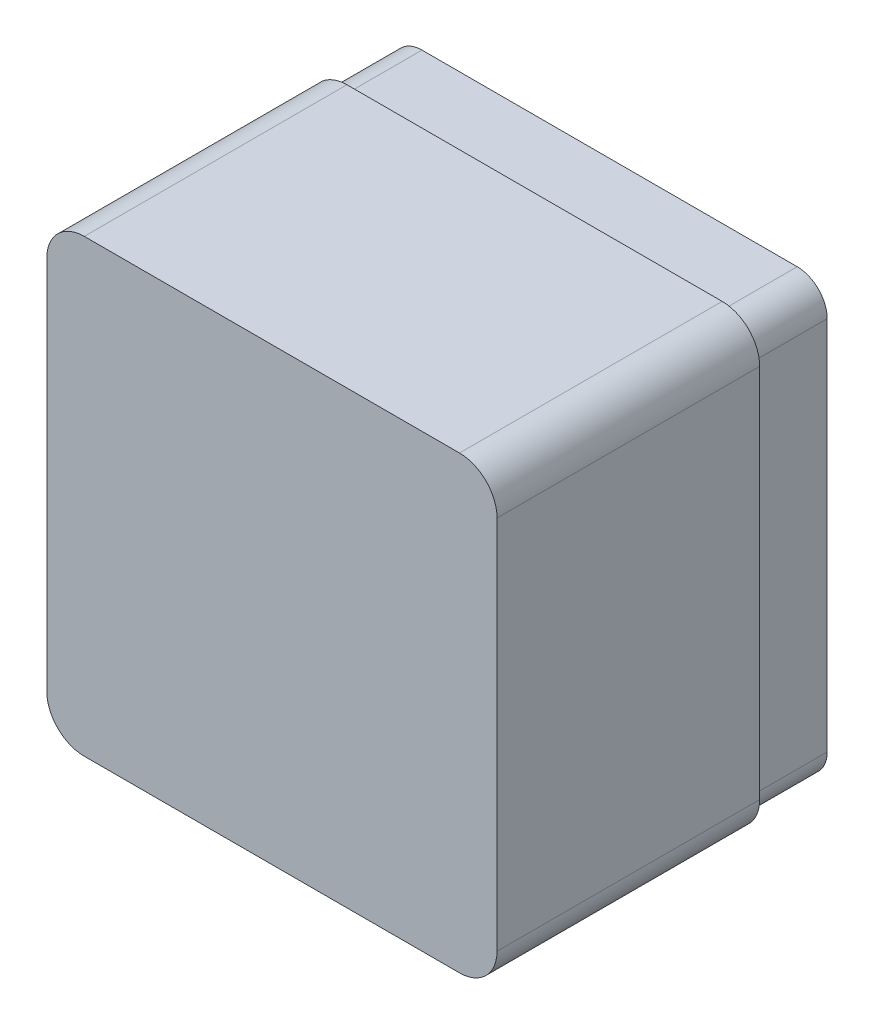
ISO-10303-21;
HEADER;
FILE_DESCRIPTION(('STEP AP214'),'2;1');
FILE_NAME('part.step','',(''),(''),'','','');
FILE_SCHEMA(('AUTOMOTIVE_DESIGN { 1 0 10303 214 1 1 1 1 }'));
ENDSEC;
DATA;
#1=APPLICATION_CONTEXT('core data for automotive mechanical design processes');
#2=APPLICATION_PROTOCOL_DEFINITION('international standard','automotive_design',2000,#1);
#3=PRODUCT_CONTEXT('',#1,'mechanical');
#4=PRODUCT('Part','Part','',(#3));
#5=PRODUCT_RELATED_PRODUCT_CATEGORY('part','',(#4));
#6=PRODUCT_DEFINITION_FORMATION('','',#4);
#7=PRODUCT_DEFINITION_CONTEXT('part definition',#1,'design');
#8=PRODUCT_DEFINITION('design','',#6,#7);
#9=PRODUCT_DEFINITION_SHAPE('','',#8);
#10=(LENGTH_UNIT() NAMED_UNIT(*) SI_UNIT(.MILLI.,.METRE.));
#11=(NAMED_UNIT(*) PLANE_ANGLE_UNIT() SI_UNIT($,.RADIAN.));
#12=(NAMED_UNIT(*) SI_UNIT($,.STERADIAN.) SOLID_ANGLE_UNIT());
#13=UNCERTAINTY_MEASURE_WITH_UNIT(LENGTH_MEASURE(1.E-05),#10,'distance_accuracy_value','');
#14=(GEOMETRIC_REPRESENTATION_CONTEXT(3) GLOBAL_UNCERTAINTY_ASSIGNED_CONTEXT((#13)) GLOBAL_UNIT_ASSIGNED_CONTEXT((#10,
#11,#12)) REPRESENTATION_CONTEXT('',''));
#15=CARTESIAN_POINT('',(0.,0.,0.));
#16=DIRECTION('',(0.,0.,1.));
#17=DIRECTION('',(1.,0.,0.));
#18=AXIS2_PLACEMENT_3D('',#15,#16,#17);
#19=CARTESIAN_POINT('',(0.,0.,0.));
#20=DIRECTION('',(0.,0.,-1.));
#21=DIRECTION('',(-1.,0.,0.));
#22=AXIS2_PLACEMENT_3D('',#19,#20,#21);
#23=PLANE('',#22);
#24=CARTESIAN_POINT('',(110.,10.,0.));
#25=DIRECTION('',(0.,0.,-1.));
#26=DIRECTION('',(-1.,0.,0.));
#27=AXIS2_PLACEMENT_3D('',#24,#25,#26);
#28=CIRCLE('',#27,6.);
#29=CARTESIAN_POINT('',(116.,10.,0.));
#30=VERTEX_POINT('',#29);
#31=CARTESIAN_POINT('',(110.,4.,0.));
#32=VERTEX_POINT('',#31);
#33=EDGE_CURVE('E365',#30,#32,#28,.T.);
#34=ORIENTED_EDGE('',*,*,#33,.F.);
#35=DIRECTION('',(0.,1.,0.));
#36=VECTOR('',#35,1.);
#37=CARTESIAN_POINT('',(116.,0.,0.));
#38=LINE('',#37,#36);
#39=CARTESIAN_POINT('',(116.,110.,0.));
#40=VERTEX_POINT('',#39);
#41=EDGE_CURVE('E387',#30,#40,#38,.T.);
#42=ORIENTED_EDGE('',*,*,#41,.T.);
#43=CARTESIAN_POINT('',(110.,110.,0.));
#44=DIRECTION('',(0.,0.,-1.));
#45=DIRECTION('',(-1.,0.,0.));
#46=AXIS2_PLACEMENT_3D('',#43,#44,#45);
#47=CIRCLE('',#46,6.);
#48=CARTESIAN_POINT('',(110.,116.,0.));
#49=VERTEX_POINT('',#48);
#50=EDGE_CURVE('E388',#49,#40,#47,.T.);
#51=ORIENTED_EDGE('',*,*,#50,.F.);
#52=DIRECTION('',(-1.,0.,0.));
#53=VECTOR('',#52,1.);
#54=CARTESIAN_POINT('',(0.,116.,0.));
#55=LINE('',#54,#53);
#56=CARTESIAN_POINT('',(9.99999999999998,116.,0.));
#57=VERTEX_POINT('',#56);
#58=EDGE_CURVE('E330',#49,#57,#55,.T.);
#59=ORIENTED_EDGE('',*,*,#58,.T.);
#60=CARTESIAN_POINT('',(9.99999999999999,110.,0.));
#61=DIRECTION('',(0.,0.,-1.));
#62=DIRECTION('',(-1.,0.,0.));
#63=AXIS2_PLACEMENT_3D('',#60,#61,#62);
#64=CIRCLE('',#63,6.);
#65=CARTESIAN_POINT('',(3.99999999999999,110.,0.));
#66=VERTEX_POINT('',#65);
#67=EDGE_CURVE('E369',#66,#57,#64,.T.);
#68=ORIENTED_EDGE('',*,*,#67,.F.);
#69=DIRECTION('',(0.,-1.,0.));
#70=VECTOR('',#69,1.);
#71=CARTESIAN_POINT('',(4.,0.,0.));
#72=LINE('',#71,#70);
#73=CARTESIAN_POINT('',(4.,10.,0.));
#74=VERTEX_POINT('',#73);
#75=EDGE_CURVE('E319',#66,#74,#72,.T.);
#76=ORIENTED_EDGE('',*,*,#75,.T.);
#77=CARTESIAN_POINT('',(9.99999999999999,10.,0.));
#78=DIRECTION('',(0.,0.,-1.));
#79=DIRECTION('',(-1.,0.,0.));
#80=AXIS2_PLACEMENT_3D('',#77,#78,#79);
#81=CIRCLE('',#80,6.);
#82=CARTESIAN_POINT('',(10.,4.,0.));
#83=VERTEX_POINT('',#82);
#84=EDGE_CURVE('E383',#83,#74,#81,.T.);
#85=ORIENTED_EDGE('',*,*,#84,.F.);
#86=DIRECTION('',(1.,0.,0.));
#87=VECTOR('',#86,1.);
#88=CARTESIAN_POINT('',(0.,4.,0.));
#89=LINE('',#88,#87);
#90=EDGE_CURVE('E380',#83,#32,#89,.T.);
#91=ORIENTED_EDGE('',*,*,#90,.T.);
#92=EDGE_LOOP('',(#34,#42,#51,#59,#68,#76,#85,#91));
#93=FACE_BOUND('',#92,.T.);
#94=DIRECTION('',(1.,0.,0.));
#95=VECTOR('',#94,1.);
#96=CARTESIAN_POINT('',(9.99999999999998,118.,0.));
#97=LINE('',#96,#95);
#98=CARTESIAN_POINT('',(9.99999999999998,118.,0.));
#99=VERTEX_POINT('',#98);
#100=CARTESIAN_POINT('',(110.,118.,0.));
#101=VERTEX_POINT('',#100);
#102=EDGE_CURVE('E228',#99,#101,#97,.T.);
#103=ORIENTED_EDGE('',*,*,#102,.T.);
#104=CARTESIAN_POINT('',(110.,110.,0.));
#105=DIRECTION('',(0.,0.,-1.));
#106=DIRECTION('',(-1.,0.,0.));
#107=AXIS2_PLACEMENT_3D('',#104,#105,#106);
#108=CIRCLE('',#107,7.99999999999999);
#109=CARTESIAN_POINT('',(118.,110.,0.));
#110=VERTEX_POINT('',#109);
#111=EDGE_CURVE('E255',#101,#110,#108,.T.);
#112=ORIENTED_EDGE('',*,*,#111,.T.);
#113=DIRECTION('',(0.,-1.,0.));
#114=VECTOR('',#113,1.);
#115=CARTESIAN_POINT('',(118.,110.,0.));
#116=LINE('',#115,#114);
#117=CARTESIAN_POINT('',(118.,9.99999999999999,0.));
#118=VERTEX_POINT('',#117);
#119=EDGE_CURVE('E205',#110,#118,#116,.T.);
#120=ORIENTED_EDGE('',*,*,#119,.T.);
#121=CARTESIAN_POINT('',(110.,10.,0.));
#122=DIRECTION('',(0.,0.,-1.));
#123=DIRECTION('',(-1.,0.,0.));
#124=AXIS2_PLACEMENT_3D('',#121,#122,#123);
#125=CIRCLE('',#124,7.99999999999999);
#126=CARTESIAN_POINT('',(110.,2.00000000000001,0.));
#127=VERTEX_POINT('',#126);
#128=EDGE_CURVE('E54',#118,#127,#125,.T.);
#129=ORIENTED_EDGE('',*,*,#128,.T.);
#130=DIRECTION('',(-1.,0.,0.));
#131=VECTOR('',#130,1.);
#132=CARTESIAN_POINT('',(110.,2.,0.));
#133=LINE('',#132,#131);
#134=CARTESIAN_POINT('',(9.99999999999999,2.,0.));
#135=VERTEX_POINT('',#134);
#136=EDGE_CURVE('E262',#127,#135,#133,.T.);
#137=ORIENTED_EDGE('',*,*,#136,.T.);
#138=CARTESIAN_POINT('',(9.99999999999999,10.,0.));
#139=DIRECTION('',(0.,0.,-1.));
#140=DIRECTION('',(-1.,0.,0.));
#141=AXIS2_PLACEMENT_3D('',#138,#139,#140);
#142=CIRCLE('',#141,8.);
#143=CARTESIAN_POINT('',(2.,10.,0.));
#144=VERTEX_POINT('',#143);
#145=EDGE_CURVE('E266',#135,#144,#142,.T.);
#146=ORIENTED_EDGE('',*,*,#145,.T.);
#147=DIRECTION('',(0.,1.,0.));
#148=VECTOR('',#147,1.);
#149=CARTESIAN_POINT('',(2.,10.,0.));
#150=LINE('',#149,#148);
#151=CARTESIAN_POINT('',(2.,110.,0.));
#152=VERTEX_POINT('',#151);
#153=EDGE_CURVE('E270',#144,#152,#150,.T.);
#154=ORIENTED_EDGE('',*,*,#153,.T.);
#155=CARTESIAN_POINT('',(9.99999999999999,110.,0.));
#156=DIRECTION('',(0.,0.,-1.));
#157=DIRECTION('',(-1.,0.,0.));
#158=AXIS2_PLACEMENT_3D('',#155,#156,#157);
#159=CIRCLE('',#158,7.99999999999999);
#160=EDGE_CURVE('E232',#152,#99,#159,.T.);
#161=ORIENTED_EDGE('',*,*,#160,.T.);
#162=EDGE_LOOP('',(#103,#112,#120,#129,#137,#146,#154,#161));
#163=FACE_BOUND('',#162,.T.);
#164=ADVANCED_FACE('F38',(#93,#163),#23,.T.);
#165=CARTESIAN_POINT('',(4.,0.,90.));
#166=DIRECTION('',(1.,0.,0.));
#167=DIRECTION('',(0.,1.,0.));
#168=AXIS2_PLACEMENT_3D('',#165,#166,#167);
#169=PLANE('',#168);
#170=ORIENTED_EDGE('',*,*,#75,.F.);
#171=DIRECTION('',(0.,0.,1.));
#172=VECTOR('',#171,1.);
#173=CARTESIAN_POINT('',(3.99999999999999,110.,90.));
#174=LINE('',#173,#172);
#175=CARTESIAN_POINT('',(3.99999999999999,110.,86.));
#176=VERTEX_POINT('',#175);
#177=EDGE_CURVE('E324',#176,#66,#174,.F.);
#178=ORIENTED_EDGE('',*,*,#177,.F.);
#179=DIRECTION('',(0.,-1.,0.));
#180=VECTOR('',#179,1.);
#181=CARTESIAN_POINT('',(4.,0.,86.));
#182=LINE('',#181,#180);
#183=CARTESIAN_POINT('',(4.,10.,86.));
#184=VERTEX_POINT('',#183);
#185=EDGE_CURVE('E325',#176,#184,#182,.T.);
#186=ORIENTED_EDGE('',*,*,#185,.T.);
#187=DIRECTION('',(0.,0.,1.));
#188=VECTOR('',#187,1.);
#189=CARTESIAN_POINT('',(4.,10.,90.));
#190=LINE('',#189,#188);
#191=EDGE_CURVE('E320',#74,#184,#190,.T.);
#192=ORIENTED_EDGE('',*,*,#191,.F.);
#193=EDGE_LOOP('',(#170,#178,#186,#192));
#194=FACE_BOUND('',#193,.T.);
#195=ADVANCED_FACE('F500',(#194),#169,.T.);
#196=CARTESIAN_POINT('',(0.,4.,90.));
#197=DIRECTION('',(0.,1.,0.));
#198=DIRECTION('',(0.,0.,1.));
#199=AXIS2_PLACEMENT_3D('',#196,#197,#198);
#200=PLANE('',#199);
#201=ORIENTED_EDGE('',*,*,#90,.F.);
#202=DIRECTION('',(0.,0.,1.));
#203=VECTOR('',#202,1.);
#204=CARTESIAN_POINT('',(9.99999999999999,4.,90.));
#205=LINE('',#204,#203);
#206=CARTESIAN_POINT('',(9.99999999999999,4.,86.));
#207=VERTEX_POINT('',#206);
#208=EDGE_CURVE('E362',#207,#83,#205,.F.);
#209=ORIENTED_EDGE('',*,*,#208,.F.);
#210=DIRECTION('',(1.,0.,0.));
#211=VECTOR('',#210,1.);
#212=CARTESIAN_POINT('',(0.,4.,86.));
#213=LINE('',#212,#211);
#214=CARTESIAN_POINT('',(110.,4.,86.));
#215=VERTEX_POINT('',#214);
#216=EDGE_CURVE('E329',#207,#215,#213,.T.);
#217=ORIENTED_EDGE('',*,*,#216,.T.);
#218=DIRECTION('',(0.,0.,1.));
#219=VECTOR('',#218,1.);
#220=CARTESIAN_POINT('',(110.,4.,90.));
#221=LINE('',#220,#219);
#222=EDGE_CURVE('E357',#32,#215,#221,.T.);
#223=ORIENTED_EDGE('',*,*,#222,.F.);
#224=EDGE_LOOP('',(#201,#209,#217,#223));
#225=FACE_BOUND('',#224,.T.);
#226=ADVANCED_FACE('F505',(#225),#200,.T.);
#227=CARTESIAN_POINT('',(116.,0.,90.));
#228=DIRECTION('',(-1.,0.,0.));
#229=DIRECTION('',(0.,-1.,0.));
#230=AXIS2_PLACEMENT_3D('',#227,#228,#229);
#231=PLANE('',#230);
#232=DIRECTION('',(0.,1.,0.));
#233=VECTOR('',#232,1.);
#234=CARTESIAN_POINT('',(116.,0.,86.));
#235=LINE('',#234,#233);
#236=CARTESIAN_POINT('',(116.,10.,86.));
#237=VERTEX_POINT('',#236);
#238=CARTESIAN_POINT('',(116.,110.,86.));
#239=VERTEX_POINT('',#238);
#240=EDGE_CURVE('E337',#237,#239,#235,.T.);
#241=ORIENTED_EDGE('',*,*,#240,.T.);
#242=DIRECTION('',(0.,0.,1.));
#243=VECTOR('',#242,1.);
#244=CARTESIAN_POINT('',(116.,110.,90.));
#245=LINE('',#244,#243);
#246=EDGE_CURVE('E353',#40,#239,#245,.T.);
#247=ORIENTED_EDGE('',*,*,#246,.F.);
#248=ORIENTED_EDGE('',*,*,#41,.F.);
#249=DIRECTION('',(0.,0.,1.));
#250=VECTOR('',#249,1.);
#251=CARTESIAN_POINT('',(116.,10.,90.));
#252=LINE('',#251,#250);
#253=EDGE_CURVE('E366',#237,#30,#252,.F.);
#254=ORIENTED_EDGE('',*,*,#253,.F.);
#255=EDGE_LOOP('',(#241,#247,#248,#254));
#256=FACE_BOUND('',#255,.T.);
#257=ADVANCED_FACE('F698',(#256),#231,.T.);
#258=CARTESIAN_POINT('',(0.,116.,90.));
#259=DIRECTION('',(0.,-1.,0.));
#260=DIRECTION('',(0.,0.,-1.));
#261=AXIS2_PLACEMENT_3D('',#258,#259,#260);
#262=PLANE('',#261);
#263=DIRECTION('',(-1.,0.,0.));
#264=VECTOR('',#263,1.);
#265=CARTESIAN_POINT('',(0.,116.,86.));
#266=LINE('',#265,#264);
#267=CARTESIAN_POINT('',(110.,116.,86.));
#268=VERTEX_POINT('',#267);
#269=CARTESIAN_POINT('',(9.99999999999998,116.,86.));
#270=VERTEX_POINT('',#269);
#271=EDGE_CURVE('E346',#268,#270,#266,.T.);
#272=ORIENTED_EDGE('',*,*,#271,.T.);
#273=DIRECTION('',(0.,0.,-1.));
#274=VECTOR('',#273,1.);
#275=CARTESIAN_POINT('',(9.99999999999998,116.,90.));
#276=LINE('',#275,#274);
#277=EDGE_CURVE('E341',#57,#270,#276,.F.);
#278=ORIENTED_EDGE('',*,*,#277,.F.);
#279=ORIENTED_EDGE('',*,*,#58,.F.);
#280=DIRECTION('',(0.,0.,-1.));
#281=VECTOR('',#280,1.);
#282=CARTESIAN_POINT('',(110.,116.,90.));
#283=LINE('',#282,#281);
#284=EDGE_CURVE('E333',#268,#49,#283,.T.);
#285=ORIENTED_EDGE('',*,*,#284,.F.);
#286=EDGE_LOOP('',(#272,#278,#279,#285));
#287=FACE_BOUND('',#286,.T.);
#288=ADVANCED_FACE('F689',(#287),#262,.T.);
#289=CARTESIAN_POINT('',(0.,0.,86.));
#290=DIRECTION('',(0.,0.,-1.));
#291=DIRECTION('',(-1.,0.,0.));
#292=AXIS2_PLACEMENT_3D('',#289,#290,#291);
#293=PLANE('',#292);
#294=ORIENTED_EDGE('',*,*,#216,.F.);
#295=CARTESIAN_POINT('',(9.99999999999999,10.,86.));
#296=DIRECTION('',(0.,0.,-1.));
#297=DIRECTION('',(-1.,0.,0.));
#298=AXIS2_PLACEMENT_3D('',#295,#296,#297);
#299=CIRCLE('',#298,6.);
#300=EDGE_CURVE('E349',#184,#207,#299,.F.);
#301=ORIENTED_EDGE('',*,*,#300,.F.);
#302=ORIENTED_EDGE('',*,*,#185,.F.);
#303=CARTESIAN_POINT('',(9.99999999999999,110.,86.));
#304=DIRECTION('',(0.,0.,-1.));
#305=DIRECTION('',(-1.,0.,0.));
#306=AXIS2_PLACEMENT_3D('',#303,#304,#305);
#307=CIRCLE('',#306,6.);
#308=EDGE_CURVE('E354',#270,#176,#307,.F.);
#309=ORIENTED_EDGE('',*,*,#308,.F.);
#310=ORIENTED_EDGE('',*,*,#271,.F.);
#311=CARTESIAN_POINT('',(110.,110.,86.));
#312=DIRECTION('',(0.,0.,-1.));
#313=DIRECTION('',(-1.,0.,0.));
#314=AXIS2_PLACEMENT_3D('',#311,#312,#313);
#315=CIRCLE('',#314,6.);
#316=EDGE_CURVE('E342',#239,#268,#315,.F.);
#317=ORIENTED_EDGE('',*,*,#316,.F.);
#318=ORIENTED_EDGE('',*,*,#240,.F.);
#319=CARTESIAN_POINT('',(110.,10.,86.));
#320=DIRECTION('',(0.,0.,-1.));
#321=DIRECTION('',(-1.,0.,0.));
#322=AXIS2_PLACEMENT_3D('',#319,#320,#321);
#323=CIRCLE('',#322,6.);
#324=EDGE_CURVE('E338',#215,#237,#323,.F.);
#325=ORIENTED_EDGE('',*,*,#324,.F.);
#326=EDGE_LOOP('',(#294,#301,#302,#309,#310,#317,#318,#325));
#327=FACE_BOUND('',#326,.T.);
#328=ADVANCED_FACE('F680',(#327),#293,.T.);
#329=CARTESIAN_POINT('',(110.,10.,90.));
#330=DIRECTION('',(0.,0.,-1.));
#331=DIRECTION('',(-1.,0.,0.));
#332=AXIS2_PLACEMENT_3D('',#329,#330,#331);
#333=CYLINDRICAL_SURFACE('',#332,6.);
#334=ORIENTED_EDGE('',*,*,#324,.T.);
#335=ORIENTED_EDGE('',*,*,#253,.T.);
#336=ORIENTED_EDGE('',*,*,#33,.T.);
#337=ORIENTED_EDGE('',*,*,#222,.T.);
#338=EDGE_LOOP('',(#334,#335,#336,#337));
#339=FACE_BOUND('',#338,.T.);
#340=ADVANCED_FACE('F671',(#339),#333,.F.);
#341=CARTESIAN_POINT('',(110.,110.,90.));
#342=DIRECTION('',(0.,0.,-1.));
#343=DIRECTION('',(-1.,0.,0.));
#344=AXIS2_PLACEMENT_3D('',#341,#342,#343);
#345=CYLINDRICAL_SURFACE('',#344,6.);
#346=ORIENTED_EDGE('',*,*,#316,.T.);
#347=ORIENTED_EDGE('',*,*,#284,.T.);
#348=ORIENTED_EDGE('',*,*,#50,.T.);
#349=ORIENTED_EDGE('',*,*,#246,.T.);
#350=EDGE_LOOP('',(#346,#347,#348,#349));
#351=FACE_BOUND('',#350,.T.);
#352=ADVANCED_FACE('F662',(#351),#345,.F.);
#353=CARTESIAN_POINT('',(9.99999999999999,10.,90.));
#354=DIRECTION('',(0.,0.,-1.));
#355=DIRECTION('',(-1.,0.,0.));
#356=AXIS2_PLACEMENT_3D('',#353,#354,#355);
#357=CYLINDRICAL_SURFACE('',#356,6.);
#358=ORIENTED_EDGE('',*,*,#300,.T.);
#359=ORIENTED_EDGE('',*,*,#208,.T.);
#360=ORIENTED_EDGE('',*,*,#84,.T.);
#361=ORIENTED_EDGE('',*,*,#191,.T.);
#362=EDGE_LOOP('',(#358,#359,#360,#361));
#363=FACE_BOUND('',#362,.T.);
#364=ADVANCED_FACE('F654',(#363),#357,.F.);
#365=CARTESIAN_POINT('',(9.99999999999999,110.,90.));
#366=DIRECTION('',(0.,0.,-1.));
#367=DIRECTION('',(-1.,0.,0.));
#368=AXIS2_PLACEMENT_3D('',#365,#366,#367);
#369=CYLINDRICAL_SURFACE('',#368,6.);
#370=ORIENTED_EDGE('',*,*,#308,.T.);
#371=ORIENTED_EDGE('',*,*,#177,.T.);
#372=ORIENTED_EDGE('',*,*,#67,.T.);
#373=ORIENTED_EDGE('',*,*,#277,.T.);
#374=EDGE_LOOP('',(#370,#371,#372,#373));
#375=FACE_BOUND('',#374,.T.);
#376=ADVANCED_FACE('F560',(#375),#369,.F.);
#377=CARTESIAN_POINT('',(110.,110.,20.));
#378=DIRECTION('',(0.,0.,-1.));
#379=DIRECTION('',(-1.,0.,0.));
#380=AXIS2_PLACEMENT_3D('',#377,#378,#379);
#381=PLANE('',#380);
#382=DIRECTION('',(1.,0.,0.));
#383=VECTOR('',#382,1.);
#384=CARTESIAN_POINT('',(9.99999999999998,118.,20.));
#385=LINE('',#384,#383);
#386=CARTESIAN_POINT('',(9.99999999999998,118.,20.));
#387=VERTEX_POINT('',#386);
#388=CARTESIAN_POINT('',(110.,118.,20.));
#389=VERTEX_POINT('',#388);
#390=EDGE_CURVE('E212',#387,#389,#385,.T.);
#391=ORIENTED_EDGE('',*,*,#390,.F.);
#392=CARTESIAN_POINT('',(9.99999999999999,110.,20.));
#393=DIRECTION('',(0.,0.,-1.));
#394=DIRECTION('',(-1.,0.,0.));
#395=AXIS2_PLACEMENT_3D('',#392,#393,#394);
#396=CIRCLE('',#395,7.99999999999999);
#397=CARTESIAN_POINT('',(2.,110.,20.));
#398=VERTEX_POINT('',#397);
#399=EDGE_CURVE('E249',#398,#387,#396,.T.);
#400=ORIENTED_EDGE('',*,*,#399,.F.);
#401=DIRECTION('',(0.,1.,0.));
#402=VECTOR('',#401,1.);
#403=CARTESIAN_POINT('',(2.,10.,20.));
#404=LINE('',#403,#402);
#405=CARTESIAN_POINT('',(2.,10.,20.));
#406=VERTEX_POINT('',#405);
#407=EDGE_CURVE('E245',#406,#398,#404,.T.);
#408=ORIENTED_EDGE('',*,*,#407,.F.);
#409=CARTESIAN_POINT('',(9.99999999999999,10.,20.));
#410=DIRECTION('',(0.,0.,-1.));
#411=DIRECTION('',(-1.,0.,0.));
#412=AXIS2_PLACEMENT_3D('',#409,#410,#411);
#413=CIRCLE('',#412,8.);
#414=CARTESIAN_POINT('',(9.99999999999999,2.,20.));
#415=VERTEX_POINT('',#414);
#416=EDGE_CURVE('E241',#415,#406,#413,.T.);
#417=ORIENTED_EDGE('',*,*,#416,.F.);
#418=DIRECTION('',(-1.,0.,0.));
#419=VECTOR('',#418,1.);
#420=CARTESIAN_POINT('',(110.,2.,20.));
#421=LINE('',#420,#419);
#422=CARTESIAN_POINT('',(110.,2.00000000000001,20.));
#423=VERTEX_POINT('',#422);
#424=EDGE_CURVE('E237',#423,#415,#421,.T.);
#425=ORIENTED_EDGE('',*,*,#424,.F.);
#426=CARTESIAN_POINT('',(110.,10.,20.));
#427=DIRECTION('',(0.,0.,-1.));
#428=DIRECTION('',(-1.,0.,0.));
#429=AXIS2_PLACEMENT_3D('',#426,#427,#428);
#430=CIRCLE('',#429,7.99999999999999);
#431=CARTESIAN_POINT('',(118.,9.99999999999999,20.));
#432=VERTEX_POINT('',#431);
#433=EDGE_CURVE('E222',#432,#423,#430,.T.);
#434=ORIENTED_EDGE('',*,*,#433,.F.);
#435=DIRECTION('',(0.,-1.,0.));
#436=VECTOR('',#435,1.);
#437=CARTESIAN_POINT('',(118.,110.,20.));
#438=LINE('',#437,#436);
#439=CARTESIAN_POINT('',(118.,110.,20.));
#440=VERTEX_POINT('',#439);
#441=EDGE_CURVE('E203',#440,#432,#438,.T.);
#442=ORIENTED_EDGE('',*,*,#441,.F.);
#443=CARTESIAN_POINT('',(110.,110.,20.));
#444=DIRECTION('',(0.,0.,-1.));
#445=DIRECTION('',(-1.,0.,0.));
#446=AXIS2_PLACEMENT_3D('',#443,#444,#445);
#447=CIRCLE('',#446,7.99999999999999);
#448=EDGE_CURVE('E218',#389,#440,#447,.T.);
#449=ORIENTED_EDGE('',*,*,#448,.F.);
#450=EDGE_LOOP('',(#391,#400,#408,#417,#425,#434,#442,#449));
#451=FACE_BOUND('',#450,.T.);
#452=CARTESIAN_POINT('',(110.,110.,20.));
#453=DIRECTION('',(0.,0.,-1.));
#454=DIRECTION('',(-1.,0.,0.));
#455=AXIS2_PLACEMENT_3D('',#452,#453,#454);
#456=CIRCLE('',#455,9.99999999999999);
#457=CARTESIAN_POINT('',(110.,120.,20.));
#458=VERTEX_POINT('',#457);
#459=CARTESIAN_POINT('',(120.,110.,20.));
#460=VERTEX_POINT('',#459);
#461=EDGE_CURVE('E279',#458,#460,#456,.T.);
#462=ORIENTED_EDGE('',*,*,#461,.T.);
#463=DIRECTION('',(0.,-1.,0.));
#464=VECTOR('',#463,1.);
#465=CARTESIAN_POINT('',(120.,110.,20.));
#466=LINE('',#465,#464);
#467=CARTESIAN_POINT('',(120.,10.,20.));
#468=VERTEX_POINT('',#467);
#469=EDGE_CURVE('E299',#460,#468,#466,.T.);
#470=ORIENTED_EDGE('',*,*,#469,.T.);
#471=CARTESIAN_POINT('',(110.,10.,20.));
#472=DIRECTION('',(0.,0.,-1.));
#473=DIRECTION('',(-1.,0.,0.));
#474=AXIS2_PLACEMENT_3D('',#471,#472,#473);
#475=CIRCLE('',#474,9.99999999999999);
#476=CARTESIAN_POINT('',(110.,0.,20.));
#477=VERTEX_POINT('',#476);
#478=EDGE_CURVE('E302',#468,#477,#475,.T.);
#479=ORIENTED_EDGE('',*,*,#478,.T.);
#480=DIRECTION('',(-1.,0.,0.));
#481=VECTOR('',#480,1.);
#482=CARTESIAN_POINT('',(110.,0.,20.));
#483=LINE('',#482,#481);
#484=CARTESIAN_POINT('',(9.99999999999999,0.,20.));
#485=VERTEX_POINT('',#484);
#486=EDGE_CURVE('E305',#477,#485,#483,.T.);
#487=ORIENTED_EDGE('',*,*,#486,.T.);
#488=CARTESIAN_POINT('',(9.99999999999999,10.,20.));
#489=DIRECTION('',(0.,0.,-1.));
#490=DIRECTION('',(-1.,0.,0.));
#491=AXIS2_PLACEMENT_3D('',#488,#489,#490);
#492=CIRCLE('',#491,10.);
#493=CARTESIAN_POINT('',(0.,10.,20.));
#494=VERTEX_POINT('',#493);
#495=EDGE_CURVE('E308',#485,#494,#492,.T.);
#496=ORIENTED_EDGE('',*,*,#495,.T.);
#497=DIRECTION('',(0.,1.,0.));
#498=VECTOR('',#497,1.);
#499=CARTESIAN_POINT('',(0.,10.,20.));
#500=LINE('',#499,#498);
#501=CARTESIAN_POINT('',(0.,110.,20.));
#502=VERTEX_POINT('',#501);
#503=EDGE_CURVE('E62',#494,#502,#500,.T.);
#504=ORIENTED_EDGE('',*,*,#503,.T.);
#505=CARTESIAN_POINT('',(9.99999999999999,110.,20.));
#506=DIRECTION('',(0.,0.,-1.));
#507=DIRECTION('',(-1.,0.,0.));
#508=AXIS2_PLACEMENT_3D('',#505,#506,#507);
#509=CIRCLE('',#508,10.);
#510=CARTESIAN_POINT('',(9.99999999999998,120.,20.));
#511=VERTEX_POINT('',#510);
#512=EDGE_CURVE('E313',#502,#511,#509,.T.);
#513=ORIENTED_EDGE('',*,*,#512,.T.);
#514=DIRECTION('',(1.,0.,0.));
#515=VECTOR('',#514,1.);
#516=CARTESIAN_POINT('',(9.99999999999998,120.,20.));
#517=LINE('',#516,#515);
#518=EDGE_CURVE('E316',#511,#458,#517,.T.);
#519=ORIENTED_EDGE('',*,*,#518,.T.);
#520=EDGE_LOOP('',(#462,#470,#479,#487,#496,#504,#513,#519));
#521=FACE_BOUND('',#520,.T.);
#522=ADVANCED_FACE('F217',(#451,#521),#381,.T.);
#523=CARTESIAN_POINT('',(110.,110.,20.));
#524=DIRECTION('',(0.,0.,-1.));
#525=DIRECTION('',(-1.,0.,0.));
#526=AXIS2_PLACEMENT_3D('',#523,#524,#525);
#527=CYLINDRICAL_SURFACE('',#526,7.99999999999999);
#528=ORIENTED_EDGE('',*,*,#111,.F.);
#529=DIRECTION('',(0.,0.,-1.));
#530=VECTOR('',#529,1.);
#531=CARTESIAN_POINT('',(110.,118.,20.));
#532=LINE('',#531,#530);
#533=EDGE_CURVE('E226',#389,#101,#532,.T.);
#534=ORIENTED_EDGE('',*,*,#533,.F.);
#535=ORIENTED_EDGE('',*,*,#448,.T.);
#536=DIRECTION('',(0.,0.,-1.));
#537=VECTOR('',#536,1.);
#538=CARTESIAN_POINT('',(118.,110.,20.));
#539=LINE('',#538,#537);
#540=EDGE_CURVE('E200',#440,#110,#539,.T.);
#541=ORIENTED_EDGE('',*,*,#540,.T.);
#542=EDGE_LOOP('',(#528,#534,#535,#541));
#543=FACE_BOUND('',#542,.T.);
#544=ADVANCED_FACE('F225',(#543),#527,.T.);
#545=CARTESIAN_POINT('',(9.99999999999998,118.,20.));
#546=DIRECTION('',(0.,1.,0.));
#547=DIRECTION('',(0.,0.,1.));
#548=AXIS2_PLACEMENT_3D('',#545,#546,#547);
#549=PLANE('',#548);
#550=ORIENTED_EDGE('',*,*,#102,.F.);
#551=DIRECTION('',(0.,0.,-1.));
#552=VECTOR('',#551,1.);
#553=CARTESIAN_POINT('',(9.99999999999998,118.,20.));
#554=LINE('',#553,#552);
#555=EDGE_CURVE('E280',#387,#99,#554,.T.);
#556=ORIENTED_EDGE('',*,*,#555,.F.);
#557=ORIENTED_EDGE('',*,*,#390,.T.);
#558=ORIENTED_EDGE('',*,*,#533,.T.);
#559=EDGE_LOOP('',(#550,#556,#557,#558));
#560=FACE_BOUND('',#559,.T.);
#561=ADVANCED_FACE('F568',(#560),#549,.T.);
#562=CARTESIAN_POINT('',(9.99999999999999,110.,20.));
#563=DIRECTION('',(0.,0.,-1.));
#564=DIRECTION('',(-1.,0.,0.));
#565=AXIS2_PLACEMENT_3D('',#562,#563,#564);
#566=CYLINDRICAL_SURFACE('',#565,7.99999999999999);
#567=ORIENTED_EDGE('',*,*,#160,.F.);
#568=DIRECTION('',(0.,0.,-1.));
#569=VECTOR('',#568,1.);
#570=CARTESIAN_POINT('',(2.,110.,20.));
#571=LINE('',#570,#569);
#572=EDGE_CURVE('E283',#398,#152,#571,.T.);
#573=ORIENTED_EDGE('',*,*,#572,.F.);
#574=ORIENTED_EDGE('',*,*,#399,.T.);
#575=ORIENTED_EDGE('',*,*,#555,.T.);
#576=EDGE_LOOP('',(#567,#573,#574,#575));
#577=FACE_BOUND('',#576,.T.);
#578=ADVANCED_FACE('F576',(#577),#566,.T.);
#579=CARTESIAN_POINT('',(2.,10.,20.));
#580=DIRECTION('',(-1.,0.,0.));
#581=DIRECTION('',(0.,-1.,0.));
#582=AXIS2_PLACEMENT_3D('',#579,#580,#581);
#583=PLANE('',#582);
#584=ORIENTED_EDGE('',*,*,#153,.F.);
#585=DIRECTION('',(0.,0.,-1.));
#586=VECTOR('',#585,1.);
#587=CARTESIAN_POINT('',(2.,10.,20.));
#588=LINE('',#587,#586);
#589=EDGE_CURVE('E286',#406,#144,#588,.T.);
#590=ORIENTED_EDGE('',*,*,#589,.F.);
#591=ORIENTED_EDGE('',*,*,#407,.T.);
#592=ORIENTED_EDGE('',*,*,#572,.T.);
#593=EDGE_LOOP('',(#584,#590,#591,#592));
#594=FACE_BOUND('',#593,.T.);
#595=ADVANCED_FACE('F585',(#594),#583,.T.);
#596=CARTESIAN_POINT('',(9.99999999999999,10.,20.));
#597=DIRECTION('',(0.,0.,-1.));
#598=DIRECTION('',(-1.,0.,0.));
#599=AXIS2_PLACEMENT_3D('',#596,#597,#598);
#600=CYLINDRICAL_SURFACE('',#599,8.);
#601=ORIENTED_EDGE('',*,*,#145,.F.);
#602=DIRECTION('',(0.,0.,-1.));
#603=VECTOR('',#602,1.);
#604=CARTESIAN_POINT('',(9.99999999999999,2.,20.));
#605=LINE('',#604,#603);
#606=EDGE_CURVE('E289',#415,#135,#605,.T.);
#607=ORIENTED_EDGE('',*,*,#606,.F.);
#608=ORIENTED_EDGE('',*,*,#416,.T.);
#609=ORIENTED_EDGE('',*,*,#589,.T.);
#610=EDGE_LOOP('',(#601,#607,#608,#609));
#611=FACE_BOUND('',#610,.T.);
#612=ADVANCED_FACE('F594',(#611),#600,.T.);
#613=CARTESIAN_POINT('',(110.,2.,20.));
#614=DIRECTION('',(0.,-1.,0.));
#615=DIRECTION('',(1.,0.,0.));
#616=AXIS2_PLACEMENT_3D('',#613,#614,#615);
#617=PLANE('',#616);
#618=ORIENTED_EDGE('',*,*,#136,.F.);
#619=DIRECTION('',(0.,0.,-1.));
#620=VECTOR('',#619,1.);
#621=CARTESIAN_POINT('',(110.,2.00000000000001,20.));
#622=LINE('',#621,#620);
#623=EDGE_CURVE('E292',#423,#127,#622,.T.);
#624=ORIENTED_EDGE('',*,*,#623,.F.);
#625=ORIENTED_EDGE('',*,*,#424,.T.);
#626=ORIENTED_EDGE('',*,*,#606,.T.);
#627=EDGE_LOOP('',(#618,#624,#625,#626));
#628=FACE_BOUND('',#627,.T.);
#629=ADVANCED_FACE('F603',(#628),#617,.T.);
#630=CARTESIAN_POINT('',(110.,10.,20.));
#631=DIRECTION('',(0.,0.,-1.));
#632=DIRECTION('',(-1.,0.,0.));
#633=AXIS2_PLACEMENT_3D('',#630,#631,#632);
#634=CYLINDRICAL_SURFACE('',#633,7.99999999999999);
#635=ORIENTED_EDGE('',*,*,#128,.F.);
#636=DIRECTION('',(0.,0.,-1.));
#637=VECTOR('',#636,1.);
#638=CARTESIAN_POINT('',(118.,9.99999999999999,20.));
#639=LINE('',#638,#637);
#640=EDGE_CURVE('E211',#432,#118,#639,.T.);
#641=ORIENTED_EDGE('',*,*,#640,.F.);
#642=ORIENTED_EDGE('',*,*,#433,.T.);
#643=ORIENTED_EDGE('',*,*,#623,.T.);
#644=EDGE_LOOP('',(#635,#641,#642,#643));
#645=FACE_BOUND('',#644,.T.);
#646=ADVANCED_FACE('F495',(#645),#634,.T.);
#647=CARTESIAN_POINT('',(118.,110.,20.));
#648=DIRECTION('',(1.,0.,0.));
#649=DIRECTION('',(0.,0.,-1.));
#650=AXIS2_PLACEMENT_3D('',#647,#648,#649);
#651=PLANE('',#650);
#652=ORIENTED_EDGE('',*,*,#119,.F.);
#653=ORIENTED_EDGE('',*,*,#540,.F.);
#654=ORIENTED_EDGE('',*,*,#441,.T.);
#655=ORIENTED_EDGE('',*,*,#640,.T.);
#656=EDGE_LOOP('',(#652,#653,#654,#655));
#657=FACE_BOUND('',#656,.T.);
#658=ADVANCED_FACE('F202',(#657),#651,.T.);
#659=CARTESIAN_POINT('',(0.,0.,90.));
#660=DIRECTION('',(0.,0.,-1.));
#661=DIRECTION('',(-1.,0.,0.));
#662=AXIS2_PLACEMENT_3D('',#659,#660,#661);
#663=PLANE('',#662);
#664=DIRECTION('',(1.,0.,0.));
#665=VECTOR('',#664,1.);
#666=CARTESIAN_POINT('',(0.,0.,90.));
#667=LINE('',#666,#665);
#668=CARTESIAN_POINT('',(9.99999999999999,0.,90.));
#669=VERTEX_POINT('',#668);
#670=CARTESIAN_POINT('',(110.,0.,90.));
#671=VERTEX_POINT('',#670);
#672=EDGE_CURVE('E404',#669,#671,#667,.T.);
#673=ORIENTED_EDGE('',*,*,#672,.T.);
#674=CARTESIAN_POINT('',(110.,10.,90.));
#675=DIRECTION('',(0.,0.,-1.));
#676=DIRECTION('',(-1.,0.,0.));
#677=AXIS2_PLACEMENT_3D('',#674,#675,#676);
#678=CIRCLE('',#677,10.);
#679=CARTESIAN_POINT('',(120.,10.,90.));
#680=VERTEX_POINT('',#679);
#681=EDGE_CURVE('E439',#671,#680,#678,.F.);
#682=ORIENTED_EDGE('',*,*,#681,.T.);
#683=DIRECTION('',(0.,1.,0.));
#684=VECTOR('',#683,1.);
#685=CARTESIAN_POINT('',(120.,0.,90.));
#686=LINE('',#685,#684);
#687=CARTESIAN_POINT('',(120.,110.,90.));
#688=VERTEX_POINT('',#687);
#689=EDGE_CURVE('E408',#680,#688,#686,.T.);
#690=ORIENTED_EDGE('',*,*,#689,.T.);
#691=CARTESIAN_POINT('',(110.,110.,90.));
#692=DIRECTION('',(0.,0.,-1.));
#693=DIRECTION('',(-1.,0.,0.));
#694=AXIS2_PLACEMENT_3D('',#691,#692,#693);
#695=CIRCLE('',#694,10.);
#696=CARTESIAN_POINT('',(110.,120.,90.));
#697=VERTEX_POINT('',#696);
#698=EDGE_CURVE('E436',#688,#697,#695,.F.);
#699=ORIENTED_EDGE('',*,*,#698,.T.);
#700=DIRECTION('',(-1.,0.,0.));
#701=VECTOR('',#700,1.);
#702=CARTESIAN_POINT('',(0.,120.,90.));
#703=LINE('',#702,#701);
#704=CARTESIAN_POINT('',(9.99999999999998,120.,90.));
#705=VERTEX_POINT('',#704);
#706=EDGE_CURVE('E412',#697,#705,#703,.T.);
#707=ORIENTED_EDGE('',*,*,#706,.T.);
#708=CARTESIAN_POINT('',(9.99999999999999,110.,90.));
#709=DIRECTION('',(0.,0.,-1.));
#710=DIRECTION('',(-1.,0.,0.));
#711=AXIS2_PLACEMENT_3D('',#708,#709,#710);
#712=CIRCLE('',#711,10.);
#713=CARTESIAN_POINT('',(0.,110.,90.));
#714=VERTEX_POINT('',#713);
#715=EDGE_CURVE('E430',#705,#714,#712,.F.);
#716=ORIENTED_EDGE('',*,*,#715,.T.);
#717=DIRECTION('',(0.,-1.,0.));
#718=VECTOR('',#717,1.);
#719=CARTESIAN_POINT('',(0.,0.,90.));
#720=LINE('',#719,#718);
#721=CARTESIAN_POINT('',(0.,10.,90.));
#722=VERTEX_POINT('',#721);
#723=EDGE_CURVE('E323',#714,#722,#720,.T.);
#724=ORIENTED_EDGE('',*,*,#723,.T.);
#725=CARTESIAN_POINT('',(9.99999999999999,10.,90.));
#726=DIRECTION('',(0.,0.,-1.));
#727=DIRECTION('',(-1.,0.,0.));
#728=AXIS2_PLACEMENT_3D('',#725,#726,#727);
#729=CIRCLE('',#728,10.);
#730=EDGE_CURVE('E433',#722,#669,#729,.F.);
#731=ORIENTED_EDGE('',*,*,#730,.T.);
#732=EDGE_LOOP('',(#673,#682,#690,#699,#707,#716,#724,#731));
#733=FACE_BOUND('',#732,.T.);
#734=ADVANCED_FACE('F488',(#733),#663,.F.);
#735=CARTESIAN_POINT('',(9.99999999999999,10.,90.));
#736=DIRECTION('',(0.,0.,-1.));
#737=DIRECTION('',(-1.,0.,0.));
#738=AXIS2_PLACEMENT_3D('',#735,#736,#737);
#739=CYLINDRICAL_SURFACE('',#738,10.);
#740=DIRECTION('',(0.,0.,-1.));
#741=VECTOR('',#740,1.);
#742=CARTESIAN_POINT('',(0.,10.,90.));
#743=LINE('',#742,#741);
#744=EDGE_CURVE('E11',#494,#722,#743,.F.);
#745=ORIENTED_EDGE('',*,*,#744,.F.);
#746=ORIENTED_EDGE('',*,*,#495,.F.);
#747=DIRECTION('',(0.,0.,-1.));
#748=VECTOR('',#747,1.);
#749=CARTESIAN_POINT('',(9.99999999999999,0.,90.));
#750=LINE('',#749,#748);
#751=EDGE_CURVE('E423',#669,#485,#750,.T.);
#752=ORIENTED_EDGE('',*,*,#751,.F.);
#753=ORIENTED_EDGE('',*,*,#730,.F.);
#754=EDGE_LOOP('',(#745,#746,#752,#753));
#755=FACE_BOUND('',#754,.T.);
#756=ADVANCED_FACE('F486',(#755),#739,.T.);
#757=CARTESIAN_POINT('',(110.,10.,90.));
#758=DIRECTION('',(0.,0.,-1.));
#759=DIRECTION('',(-1.,0.,0.));
#760=AXIS2_PLACEMENT_3D('',#757,#758,#759);
#761=CYLINDRICAL_SURFACE('',#760,10.);
#762=DIRECTION('',(0.,0.,-1.));
#763=VECTOR('',#762,1.);
#764=CARTESIAN_POINT('',(110.,0.,90.));
#765=LINE('',#764,#763);
#766=EDGE_CURVE('E427',#477,#671,#765,.F.);
#767=ORIENTED_EDGE('',*,*,#766,.F.);
#768=ORIENTED_EDGE('',*,*,#478,.F.);
#769=DIRECTION('',(0.,0.,-1.));
#770=VECTOR('',#769,1.);
#771=CARTESIAN_POINT('',(120.,10.,90.));
#772=LINE('',#771,#770);
#773=EDGE_CURVE('E419',#680,#468,#772,.T.);
#774=ORIENTED_EDGE('',*,*,#773,.F.);
#775=ORIENTED_EDGE('',*,*,#681,.F.);
#776=EDGE_LOOP('',(#767,#768,#774,#775));
#777=FACE_BOUND('',#776,.T.);
#778=ADVANCED_FACE('F477',(#777),#761,.T.);
#779=CARTESIAN_POINT('',(110.,110.,90.));
#780=DIRECTION('',(0.,0.,-1.));
#781=DIRECTION('',(-1.,0.,0.));
#782=AXIS2_PLACEMENT_3D('',#779,#780,#781);
#783=CYLINDRICAL_SURFACE('',#782,10.);
#784=DIRECTION('',(0.,0.,-1.));
#785=VECTOR('',#784,1.);
#786=CARTESIAN_POINT('',(120.,110.,90.));
#787=LINE('',#786,#785);
#788=EDGE_CURVE('E416',#460,#688,#787,.F.);
#789=ORIENTED_EDGE('',*,*,#788,.F.);
#790=ORIENTED_EDGE('',*,*,#461,.F.);
#791=DIRECTION('',(0.,0.,-1.));
#792=VECTOR('',#791,1.);
#793=CARTESIAN_POINT('',(110.,120.,90.));
#794=LINE('',#793,#792);
#795=EDGE_CURVE('E445',#697,#458,#794,.T.);
#796=ORIENTED_EDGE('',*,*,#795,.F.);
#797=ORIENTED_EDGE('',*,*,#698,.F.);
#798=EDGE_LOOP('',(#789,#790,#796,#797));
#799=FACE_BOUND('',#798,.T.);
#800=ADVANCED_FACE('F467',(#799),#783,.T.);
#801=CARTESIAN_POINT('',(9.99999999999999,110.,90.));
#802=DIRECTION('',(0.,0.,-1.));
#803=DIRECTION('',(-1.,0.,0.));
#804=AXIS2_PLACEMENT_3D('',#801,#802,#803);
#805=CYLINDRICAL_SURFACE('',#804,10.);
#806=DIRECTION('',(0.,0.,-1.));
#807=VECTOR('',#806,1.);
#808=CARTESIAN_POINT('',(9.99999999999999,120.,90.));
#809=LINE('',#808,#807);
#810=EDGE_CURVE('E442',#511,#705,#809,.F.);
#811=ORIENTED_EDGE('',*,*,#810,.F.);
#812=ORIENTED_EDGE('',*,*,#512,.F.);
#813=DIRECTION('',(0.,0.,-1.));
#814=VECTOR('',#813,1.);
#815=CARTESIAN_POINT('',(0.,110.,90.));
#816=LINE('',#815,#814);
#817=EDGE_CURVE('E47',#714,#502,#816,.T.);
#818=ORIENTED_EDGE('',*,*,#817,.F.);
#819=ORIENTED_EDGE('',*,*,#715,.F.);
#820=EDGE_LOOP('',(#811,#812,#818,#819));
#821=FACE_BOUND('',#820,.T.);
#822=ADVANCED_FACE('F40',(#821),#805,.T.);
#823=CARTESIAN_POINT('',(0.,120.,90.));
#824=DIRECTION('',(0.,-1.,0.));
#825=DIRECTION('',(0.,0.,-1.));
#826=AXIS2_PLACEMENT_3D('',#823,#824,#825);
#827=PLANE('',#826);
#828=ORIENTED_EDGE('',*,*,#518,.F.);
#829=ORIENTED_EDGE('',*,*,#810,.T.);
#830=ORIENTED_EDGE('',*,*,#706,.F.);
#831=ORIENTED_EDGE('',*,*,#795,.T.);
#832=EDGE_LOOP('',(#828,#829,#830,#831));
#833=FACE_BOUND('',#832,.T.);
#834=ADVANCED_FACE('F461',(#833),#827,.F.);
#835=CARTESIAN_POINT('',(120.,0.,90.));
#836=DIRECTION('',(-1.,0.,0.));
#837=DIRECTION('',(0.,-1.,0.));
#838=AXIS2_PLACEMENT_3D('',#835,#836,#837);
#839=PLANE('',#838);
#840=ORIENTED_EDGE('',*,*,#469,.F.);
#841=ORIENTED_EDGE('',*,*,#788,.T.);
#842=ORIENTED_EDGE('',*,*,#689,.F.);
#843=ORIENTED_EDGE('',*,*,#773,.T.);
#844=EDGE_LOOP('',(#840,#841,#842,#843));
#845=FACE_BOUND('',#844,.T.);
#846=ADVANCED_FACE('F471',(#845),#839,.F.);
#847=CARTESIAN_POINT('',(0.,0.,90.));
#848=DIRECTION('',(0.,1.,0.));
#849=DIRECTION('',(0.,0.,1.));
#850=AXIS2_PLACEMENT_3D('',#847,#848,#849);
#851=PLANE('',#850);
#852=ORIENTED_EDGE('',*,*,#486,.F.);
#853=ORIENTED_EDGE('',*,*,#766,.T.);
#854=ORIENTED_EDGE('',*,*,#672,.F.);
#855=ORIENTED_EDGE('',*,*,#751,.T.);
#856=EDGE_LOOP('',(#852,#853,#854,#855));
#857=FACE_BOUND('',#856,.T.);
#858=ADVANCED_FACE('F481',(#857),#851,.F.);
#859=CARTESIAN_POINT('',(0.,0.,90.));
#860=DIRECTION('',(1.,0.,0.));
#861=DIRECTION('',(0.,1.,0.));
#862=AXIS2_PLACEMENT_3D('',#859,#860,#861);
#863=PLANE('',#862);
#864=ORIENTED_EDGE('',*,*,#503,.F.);
#865=ORIENTED_EDGE('',*,*,#744,.T.);
#866=ORIENTED_EDGE('',*,*,#723,.F.);
#867=ORIENTED_EDGE('',*,*,#817,.T.);
#868=EDGE_LOOP('',(#864,#865,#866,#867));
#869=FACE_BOUND('',#868,.T.);
#870=ADVANCED_FACE('F453',(#869),#863,.F.);
#871=CLOSED_SHELL('',(#164,#195,#226,#257,#288,#328,#340,#352,#364,#376,#522,#544,#561,#578,
#595,#612,#629,#646,#658,#734,#756,#778,#800,#822,#834,#846,#858,#870));
#872=MANIFOLD_SOLID_BREP('B2',#871);
#873=ADVANCED_BREP_SHAPE_REPRESENTATION('',(#18,#872),#14);
#874=SHAPE_DEFINITION_REPRESENTATION(#9,#873);
ENDSEC;
END-ISO-10303-21;
